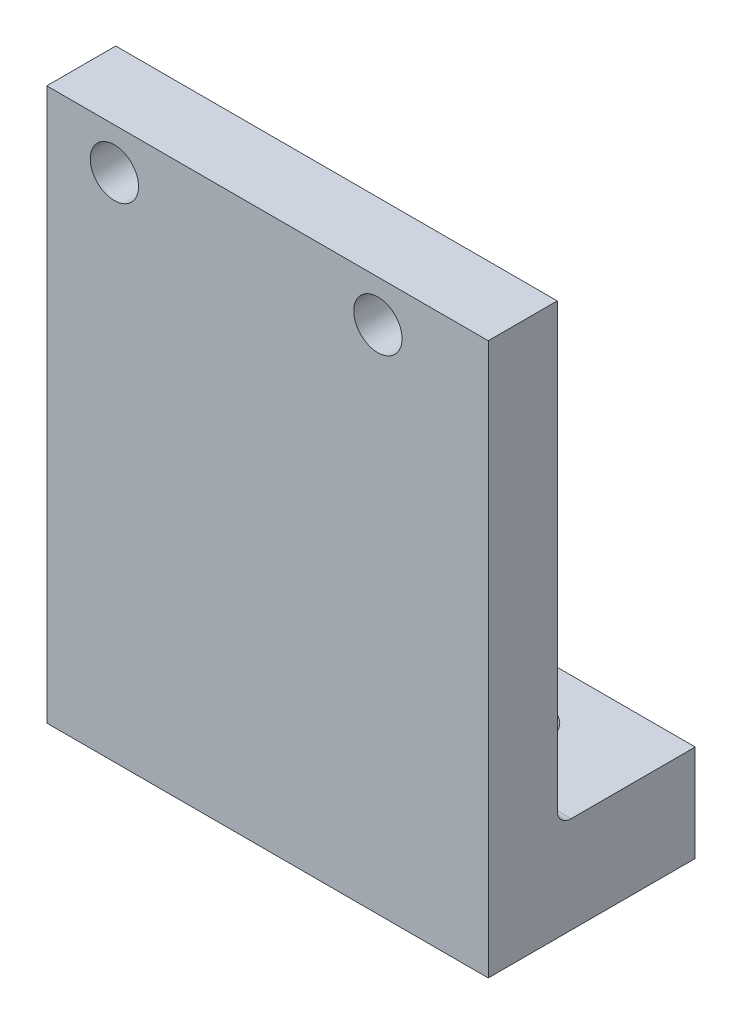
ISO-10303-21;
HEADER;
FILE_DESCRIPTION(('STEP AP214'),'2;1');
FILE_NAME('part.step','',(''),(''),'','','');
FILE_SCHEMA(('AUTOMOTIVE_DESIGN { 1 0 10303 214 1 1 1 1 }'));
ENDSEC;
DATA;
#1=APPLICATION_CONTEXT('core data for automotive mechanical design processes');
#2=APPLICATION_PROTOCOL_DEFINITION('international standard','automotive_design',2000,#1);
#3=PRODUCT_CONTEXT('',#1,'mechanical');
#4=PRODUCT('Part','Part','',(#3));
#5=PRODUCT_RELATED_PRODUCT_CATEGORY('part','',(#4));
#6=PRODUCT_DEFINITION_FORMATION('','',#4);
#7=PRODUCT_DEFINITION_CONTEXT('part definition',#1,'design');
#8=PRODUCT_DEFINITION('design','',#6,#7);
#9=PRODUCT_DEFINITION_SHAPE('','',#8);
#10=(LENGTH_UNIT() NAMED_UNIT(*) SI_UNIT(.MILLI.,.METRE.));
#11=(NAMED_UNIT(*) PLANE_ANGLE_UNIT() SI_UNIT($,.RADIAN.));
#12=(NAMED_UNIT(*) SI_UNIT($,.STERADIAN.) SOLID_ANGLE_UNIT());
#13=UNCERTAINTY_MEASURE_WITH_UNIT(LENGTH_MEASURE(1.E-05),#10,'distance_accuracy_value','');
#14=(GEOMETRIC_REPRESENTATION_CONTEXT(3) GLOBAL_UNCERTAINTY_ASSIGNED_CONTEXT((#13)) GLOBAL_UNIT_ASSIGNED_CONTEXT((#10,
#11,#12)) REPRESENTATION_CONTEXT('',''));
#15=CARTESIAN_POINT('',(0.,0.,0.));
#16=DIRECTION('',(0.,0.,1.));
#17=DIRECTION('',(1.,0.,0.));
#18=AXIS2_PLACEMENT_3D('',#15,#16,#17);
#19=CARTESIAN_POINT('',(0.,0.,0.));
#20=DIRECTION('',(0.,0.,1.));
#21=DIRECTION('',(1.,0.,0.));
#22=AXIS2_PLACEMENT_3D('',#19,#20,#21);
#23=PLANE('',#22);
#24=CARTESIAN_POINT('',(-11.1,7.,0.));
#25=DIRECTION('',(0.,0.,1.));
#26=DIRECTION('',(1.,0.,0.));
#27=AXIS2_PLACEMENT_3D('',#24,#25,#26);
#28=CIRCLE('',#27,1.75);
#29=CARTESIAN_POINT('',(-9.35,7.,0.));
#30=VERTEX_POINT('',#29);
#31=EDGE_CURVE('E116',#30,#30,#28,.T.);
#32=ORIENTED_EDGE('',*,*,#31,.T.);
#33=EDGE_LOOP('',(#32));
#34=FACE_BOUND('',#33,.T.);
#35=CARTESIAN_POINT('',(8.,7.,0.));
#36=DIRECTION('',(0.,0.,1.));
#37=DIRECTION('',(1.,0.,0.));
#38=AXIS2_PLACEMENT_3D('',#35,#36,#37);
#39=CIRCLE('',#38,1.75);
#40=CARTESIAN_POINT('',(9.75,7.,0.));
#41=VERTEX_POINT('',#40);
#42=EDGE_CURVE('E120',#41,#41,#39,.T.);
#43=ORIENTED_EDGE('',*,*,#42,.T.);
#44=EDGE_LOOP('',(#43));
#45=FACE_BOUND('',#44,.T.);
#46=DIRECTION('',(0.,1.,0.));
#47=VECTOR('',#46,1.);
#48=CARTESIAN_POINT('',(16.,10.,0.));
#49=LINE('',#48,#47);
#50=CARTESIAN_POINT('',(16.,-22.,0.));
#51=VERTEX_POINT('',#50);
#52=CARTESIAN_POINT('',(16.,10.,0.));
#53=VERTEX_POINT('',#52);
#54=EDGE_CURVE('E126',#51,#53,#49,.T.);
#55=ORIENTED_EDGE('',*,*,#54,.F.);
#56=DIRECTION('',(1.,0.,0.));
#57=VECTOR('',#56,1.);
#58=CARTESIAN_POINT('',(-16.,-22.,0.));
#59=LINE('',#58,#57);
#60=CARTESIAN_POINT('',(-16.,-22.,0.));
#61=VERTEX_POINT('',#60);
#62=EDGE_CURVE('E38',#51,#61,#59,.F.);
#63=ORIENTED_EDGE('',*,*,#62,.T.);
#64=DIRECTION('',(0.,-1.,0.));
#65=VECTOR('',#64,1.);
#66=CARTESIAN_POINT('',(-16.,10.,0.));
#67=LINE('',#66,#65);
#68=CARTESIAN_POINT('',(-16.,10.,0.));
#69=VERTEX_POINT('',#68);
#70=EDGE_CURVE('E131',#69,#61,#67,.T.);
#71=ORIENTED_EDGE('',*,*,#70,.F.);
#72=DIRECTION('',(-1.,0.,0.));
#73=VECTOR('',#72,1.);
#74=CARTESIAN_POINT('',(16.,10.,0.));
#75=LINE('',#74,#73);
#76=EDGE_CURVE('E137',#53,#69,#75,.T.);
#77=ORIENTED_EDGE('',*,*,#76,.F.);
#78=EDGE_LOOP('',(#55,#63,#71,#77));
#79=FACE_BOUND('',#78,.T.);
#80=ADVANCED_FACE('F17',(#34,#45,#79),#23,.F.);
#81=CARTESIAN_POINT('',(0.,0.,5.));
#82=DIRECTION('',(0.,0.,1.));
#83=DIRECTION('',(1.,0.,0.));
#84=AXIS2_PLACEMENT_3D('',#81,#82,#83);
#85=PLANE('',#84);
#86=CARTESIAN_POINT('',(8.,7.,5.));
#87=DIRECTION('',(0.,0.,1.));
#88=DIRECTION('',(1.,0.,0.));
#89=AXIS2_PLACEMENT_3D('',#86,#87,#88);
#90=CIRCLE('',#89,1.75);
#91=CARTESIAN_POINT('',(9.75,7.,5.));
#92=VERTEX_POINT('',#91);
#93=EDGE_CURVE('E123',#92,#92,#90,.T.);
#94=ORIENTED_EDGE('',*,*,#93,.F.);
#95=EDGE_LOOP('',(#94));
#96=FACE_BOUND('',#95,.T.);
#97=DIRECTION('',(0.,1.,0.));
#98=VECTOR('',#97,1.);
#99=CARTESIAN_POINT('',(16.,10.,5.));
#100=LINE('',#99,#98);
#101=CARTESIAN_POINT('',(16.,-30.,5.));
#102=VERTEX_POINT('',#101);
#103=CARTESIAN_POINT('',(16.,10.,5.));
#104=VERTEX_POINT('',#103);
#105=EDGE_CURVE('E82',#102,#104,#100,.T.);
#106=ORIENTED_EDGE('',*,*,#105,.T.);
#107=DIRECTION('',(-1.,0.,0.));
#108=VECTOR('',#107,1.);
#109=CARTESIAN_POINT('',(16.,10.,5.));
#110=LINE('',#109,#108);
#111=CARTESIAN_POINT('',(-16.,10.,5.));
#112=VERTEX_POINT('',#111);
#113=EDGE_CURVE('E130',#104,#112,#110,.T.);
#114=ORIENTED_EDGE('',*,*,#113,.T.);
#115=DIRECTION('',(0.,-1.,0.));
#116=VECTOR('',#115,1.);
#117=CARTESIAN_POINT('',(-16.,10.,5.));
#118=LINE('',#117,#116);
#119=CARTESIAN_POINT('',(-16.,-30.,5.));
#120=VERTEX_POINT('',#119);
#121=EDGE_CURVE('E133',#112,#120,#118,.T.);
#122=ORIENTED_EDGE('',*,*,#121,.T.);
#123=DIRECTION('',(1.,0.,0.));
#124=VECTOR('',#123,1.);
#125=CARTESIAN_POINT('',(-16.,-30.,5.));
#126=LINE('',#125,#124);
#127=EDGE_CURVE('E86',#120,#102,#126,.T.);
#128=ORIENTED_EDGE('',*,*,#127,.T.);
#129=EDGE_LOOP('',(#106,#114,#122,#128));
#130=FACE_BOUND('',#129,.T.);
#131=CARTESIAN_POINT('',(-11.1,7.,5.));
#132=DIRECTION('',(0.,0.,1.));
#133=DIRECTION('',(1.,0.,0.));
#134=AXIS2_PLACEMENT_3D('',#131,#132,#133);
#135=CIRCLE('',#134,1.75);
#136=CARTESIAN_POINT('',(-9.35,7.,5.));
#137=VERTEX_POINT('',#136);
#138=EDGE_CURVE('E117',#137,#137,#135,.T.);
#139=ORIENTED_EDGE('',*,*,#138,.F.);
#140=EDGE_LOOP('',(#139));
#141=FACE_BOUND('',#140,.T.);
#142=ADVANCED_FACE('F164',(#96,#130,#141),#85,.T.);
#143=CARTESIAN_POINT('',(16.,10.,5.));
#144=DIRECTION('',(-1.,0.,0.));
#145=DIRECTION('',(0.,-1.,0.));
#146=AXIS2_PLACEMENT_3D('',#143,#144,#145);
#147=PLANE('',#146);
#148=DIRECTION('',(0.,0.,-1.));
#149=VECTOR('',#148,1.);
#150=CARTESIAN_POINT('',(16.,-30.,5.));
#151=LINE('',#150,#149);
#152=CARTESIAN_POINT('',(16.,-30.,-10.));
#153=VERTEX_POINT('',#152);
#154=EDGE_CURVE('E75',#102,#153,#151,.T.);
#155=ORIENTED_EDGE('',*,*,#154,.T.);
#156=DIRECTION('',(0.,-1.,0.));
#157=VECTOR('',#156,1.);
#158=CARTESIAN_POINT('',(16.,-30.,-10.));
#159=LINE('',#158,#157);
#160=CARTESIAN_POINT('',(16.,-23.,-10.));
#161=VERTEX_POINT('',#160);
#162=EDGE_CURVE('E79',#161,#153,#159,.T.);
#163=ORIENTED_EDGE('',*,*,#162,.F.);
#164=DIRECTION('',(0.,0.,1.));
#165=VECTOR('',#164,1.);
#166=CARTESIAN_POINT('',(16.,-23.,-10.));
#167=LINE('',#166,#165);
#168=CARTESIAN_POINT('',(16.,-23.,-1.));
#169=VERTEX_POINT('',#168);
#170=EDGE_CURVE('E111',#161,#169,#167,.T.);
#171=ORIENTED_EDGE('',*,*,#170,.T.);
#172=CARTESIAN_POINT('',(16.,-22.,-1.));
#173=DIRECTION('',(-1.,0.,0.));
#174=DIRECTION('',(0.,-1.,0.));
#175=AXIS2_PLACEMENT_3D('',#172,#173,#174);
#176=CIRCLE('',#175,1.);
#177=EDGE_CURVE('E25',#169,#51,#176,.T.);
#178=ORIENTED_EDGE('',*,*,#177,.T.);
#179=ORIENTED_EDGE('',*,*,#54,.T.);
#180=DIRECTION('',(0.,0.,-1.));
#181=VECTOR('',#180,1.);
#182=CARTESIAN_POINT('',(16.,10.,5.));
#183=LINE('',#182,#181);
#184=EDGE_CURVE('E144',#104,#53,#183,.T.);
#185=ORIENTED_EDGE('',*,*,#184,.F.);
#186=ORIENTED_EDGE('',*,*,#105,.F.);
#187=EDGE_LOOP('',(#155,#163,#171,#178,#179,#185,#186));
#188=FACE_BOUND('',#187,.T.);
#189=ADVANCED_FACE('F77',(#188),#147,.F.);
#190=CARTESIAN_POINT('',(16.,10.,5.));
#191=DIRECTION('',(0.,-1.,0.));
#192=DIRECTION('',(1.,0.,0.));
#193=AXIS2_PLACEMENT_3D('',#190,#191,#192);
#194=PLANE('',#193);
#195=ORIENTED_EDGE('',*,*,#76,.T.);
#196=DIRECTION('',(0.,0.,-1.));
#197=VECTOR('',#196,1.);
#198=CARTESIAN_POINT('',(-16.,10.,5.));
#199=LINE('',#198,#197);
#200=EDGE_CURVE('E141',#112,#69,#199,.T.);
#201=ORIENTED_EDGE('',*,*,#200,.F.);
#202=ORIENTED_EDGE('',*,*,#113,.F.);
#203=ORIENTED_EDGE('',*,*,#184,.T.);
#204=EDGE_LOOP('',(#195,#201,#202,#203));
#205=FACE_BOUND('',#204,.T.);
#206=ADVANCED_FACE('F162',(#205),#194,.F.);
#207=CARTESIAN_POINT('',(-16.,10.,5.));
#208=DIRECTION('',(1.,0.,0.));
#209=DIRECTION('',(0.,0.,-1.));
#210=AXIS2_PLACEMENT_3D('',#207,#208,#209);
#211=PLANE('',#210);
#212=ORIENTED_EDGE('',*,*,#70,.T.);
#213=CARTESIAN_POINT('',(-16.,-22.,-1.));
#214=DIRECTION('',(1.,0.,0.));
#215=DIRECTION('',(0.,0.,-1.));
#216=AXIS2_PLACEMENT_3D('',#213,#214,#215);
#217=CIRCLE('',#216,1.);
#218=CARTESIAN_POINT('',(-16.,-23.,-1.));
#219=VERTEX_POINT('',#218);
#220=EDGE_CURVE('E11',#61,#219,#217,.T.);
#221=ORIENTED_EDGE('',*,*,#220,.T.);
#222=DIRECTION('',(0.,0.,1.));
#223=VECTOR('',#222,1.);
#224=CARTESIAN_POINT('',(-16.,-23.,-10.));
#225=LINE('',#224,#223);
#226=CARTESIAN_POINT('',(-16.,-23.,-10.));
#227=VERTEX_POINT('',#226);
#228=EDGE_CURVE('E113',#227,#219,#225,.T.);
#229=ORIENTED_EDGE('',*,*,#228,.F.);
#230=DIRECTION('',(0.,1.,0.));
#231=VECTOR('',#230,1.);
#232=CARTESIAN_POINT('',(-16.,-30.,-10.));
#233=LINE('',#232,#231);
#234=CARTESIAN_POINT('',(-16.,-30.,-10.));
#235=VERTEX_POINT('',#234);
#236=EDGE_CURVE('E94',#235,#227,#233,.T.);
#237=ORIENTED_EDGE('',*,*,#236,.F.);
#238=DIRECTION('',(0.,0.,-1.));
#239=VECTOR('',#238,1.);
#240=CARTESIAN_POINT('',(-16.,-30.,5.));
#241=LINE('',#240,#239);
#242=EDGE_CURVE('E85',#120,#235,#241,.T.);
#243=ORIENTED_EDGE('',*,*,#242,.F.);
#244=ORIENTED_EDGE('',*,*,#121,.F.);
#245=ORIENTED_EDGE('',*,*,#200,.T.);
#246=EDGE_LOOP('',(#212,#221,#229,#237,#243,#244,#245));
#247=FACE_BOUND('',#246,.T.);
#248=ADVANCED_FACE('F157',(#247),#211,.F.);
#249=CARTESIAN_POINT('',(-16.,-30.,5.));
#250=DIRECTION('',(0.,1.,0.));
#251=DIRECTION('',(0.,0.,1.));
#252=AXIS2_PLACEMENT_3D('',#249,#250,#251);
#253=PLANE('',#252);
#254=CARTESIAN_POINT('',(-8.,-30.,-5.));
#255=DIRECTION('',(0.,1.,0.));
#256=DIRECTION('',(-1.,0.,0.));
#257=AXIS2_PLACEMENT_3D('',#254,#255,#256);
#258=CIRCLE('',#257,2.25);
#259=CARTESIAN_POINT('',(-10.25,-30.,-5.));
#260=VERTEX_POINT('',#259);
#261=EDGE_CURVE('E100',#260,#260,#258,.T.);
#262=ORIENTED_EDGE('',*,*,#261,.T.);
#263=EDGE_LOOP('',(#262));
#264=FACE_BOUND('',#263,.T.);
#265=CARTESIAN_POINT('',(8.,-30.,-5.));
#266=DIRECTION('',(0.,1.,0.));
#267=DIRECTION('',(-1.,0.,0.));
#268=AXIS2_PLACEMENT_3D('',#265,#266,#267);
#269=CIRCLE('',#268,2.25);
#270=CARTESIAN_POINT('',(5.75,-30.,-5.));
#271=VERTEX_POINT('',#270);
#272=EDGE_CURVE('E288',#271,#271,#269,.T.);
#273=ORIENTED_EDGE('',*,*,#272,.T.);
#274=EDGE_LOOP('',(#273));
#275=FACE_BOUND('',#274,.T.);
#276=ORIENTED_EDGE('',*,*,#242,.T.);
#277=DIRECTION('',(-1.,0.,0.));
#278=VECTOR('',#277,1.);
#279=CARTESIAN_POINT('',(16.,-30.,-10.));
#280=LINE('',#279,#278);
#281=EDGE_CURVE('E89',#153,#235,#280,.T.);
#282=ORIENTED_EDGE('',*,*,#281,.F.);
#283=ORIENTED_EDGE('',*,*,#154,.F.);
#284=ORIENTED_EDGE('',*,*,#127,.F.);
#285=EDGE_LOOP('',(#276,#282,#283,#284));
#286=FACE_BOUND('',#285,.T.);
#287=ADVANCED_FACE('F90',(#264,#275,#286),#253,.F.);
#288=CARTESIAN_POINT('',(8.,7.,5.));
#289=DIRECTION('',(0.,0.,-1.));
#290=DIRECTION('',(-1.,0.,0.));
#291=AXIS2_PLACEMENT_3D('',#288,#289,#290);
#292=CYLINDRICAL_SURFACE('',#291,1.75);
#293=ORIENTED_EDGE('',*,*,#93,.T.);
#294=EDGE_LOOP('',(#293));
#295=FACE_BOUND('',#294,.T.);
#296=ORIENTED_EDGE('',*,*,#42,.F.);
#297=EDGE_LOOP('',(#296));
#298=FACE_BOUND('',#297,.T.);
#299=ADVANCED_FACE('F174',(#295,#298),#292,.F.);
#300=CARTESIAN_POINT('',(-11.1,7.,5.));
#301=DIRECTION('',(0.,0.,-1.));
#302=DIRECTION('',(-1.,0.,0.));
#303=AXIS2_PLACEMENT_3D('',#300,#301,#302);
#304=CYLINDRICAL_SURFACE('',#303,1.75);
#305=ORIENTED_EDGE('',*,*,#138,.T.);
#306=EDGE_LOOP('',(#305));
#307=FACE_BOUND('',#306,.T.);
#308=ORIENTED_EDGE('',*,*,#31,.F.);
#309=EDGE_LOOP('',(#308));
#310=FACE_BOUND('',#309,.T.);
#311=ADVANCED_FACE('F171',(#307,#310),#304,.F.);
#312=CARTESIAN_POINT('',(16.,-23.,-10.));
#313=DIRECTION('',(0.,-1.,0.));
#314=DIRECTION('',(0.,0.,-1.));
#315=AXIS2_PLACEMENT_3D('',#312,#313,#314);
#316=PLANE('',#315);
#317=CARTESIAN_POINT('',(-8.,-23.,-5.));
#318=DIRECTION('',(0.,1.,0.));
#319=DIRECTION('',(-1.,0.,0.));
#320=AXIS2_PLACEMENT_3D('',#317,#318,#319);
#321=CIRCLE('',#320,2.25);
#322=CARTESIAN_POINT('',(-10.25,-23.,-5.));
#323=VERTEX_POINT('',#322);
#324=EDGE_CURVE('E103',#323,#323,#321,.T.);
#325=ORIENTED_EDGE('',*,*,#324,.F.);
#326=EDGE_LOOP('',(#325));
#327=FACE_BOUND('',#326,.T.);
#328=CARTESIAN_POINT('',(8.,-23.,-5.));
#329=DIRECTION('',(0.,1.,0.));
#330=DIRECTION('',(-1.,0.,0.));
#331=AXIS2_PLACEMENT_3D('',#328,#329,#330);
#332=CIRCLE('',#331,2.25);
#333=CARTESIAN_POINT('',(5.75,-23.,-5.));
#334=VERTEX_POINT('',#333);
#335=EDGE_CURVE('E106',#334,#334,#332,.T.);
#336=ORIENTED_EDGE('',*,*,#335,.F.);
#337=EDGE_LOOP('',(#336));
#338=FACE_BOUND('',#337,.T.);
#339=ORIENTED_EDGE('',*,*,#228,.T.);
#340=DIRECTION('',(1.,0.,0.));
#341=VECTOR('',#340,1.);
#342=CARTESIAN_POINT('',(16.,-23.,-1.));
#343=LINE('',#342,#341);
#344=EDGE_CURVE('E147',#219,#169,#343,.T.);
#345=ORIENTED_EDGE('',*,*,#344,.T.);
#346=ORIENTED_EDGE('',*,*,#170,.F.);
#347=DIRECTION('',(1.,0.,0.));
#348=VECTOR('',#347,1.);
#349=CARTESIAN_POINT('',(16.,-23.,-10.));
#350=LINE('',#349,#348);
#351=EDGE_CURVE('E98',#227,#161,#350,.T.);
#352=ORIENTED_EDGE('',*,*,#351,.F.);
#353=EDGE_LOOP('',(#339,#345,#346,#352));
#354=FACE_BOUND('',#353,.T.);
#355=ADVANCED_FACE('F152',(#327,#338,#354),#316,.F.);
#356=CARTESIAN_POINT('',(0.,0.,-10.));
#357=DIRECTION('',(0.,0.,1.));
#358=DIRECTION('',(1.,0.,0.));
#359=AXIS2_PLACEMENT_3D('',#356,#357,#358);
#360=PLANE('',#359);
#361=ORIENTED_EDGE('',*,*,#162,.T.);
#362=ORIENTED_EDGE('',*,*,#281,.T.);
#363=ORIENTED_EDGE('',*,*,#236,.T.);
#364=ORIENTED_EDGE('',*,*,#351,.T.);
#365=EDGE_LOOP('',(#361,#362,#363,#364));
#366=FACE_BOUND('',#365,.T.);
#367=ADVANCED_FACE('F96',(#366),#360,.F.);
#368=CARTESIAN_POINT('',(8.,-30.,-5.));
#369=DIRECTION('',(0.,1.,0.));
#370=DIRECTION('',(-1.,0.,0.));
#371=AXIS2_PLACEMENT_3D('',#368,#369,#370);
#372=CYLINDRICAL_SURFACE('',#371,2.25);
#373=ORIENTED_EDGE('',*,*,#272,.F.);
#374=EDGE_LOOP('',(#373));
#375=FACE_BOUND('',#374,.T.);
#376=ORIENTED_EDGE('',*,*,#335,.T.);
#377=EDGE_LOOP('',(#376));
#378=FACE_BOUND('',#377,.T.);
#379=ADVANCED_FACE('F253',(#375,#378),#372,.F.);
#380=CARTESIAN_POINT('',(-8.,-30.,-5.));
#381=DIRECTION('',(0.,1.,0.));
#382=DIRECTION('',(-1.,0.,0.));
#383=AXIS2_PLACEMENT_3D('',#380,#381,#382);
#384=CYLINDRICAL_SURFACE('',#383,2.25);
#385=ORIENTED_EDGE('',*,*,#261,.F.);
#386=EDGE_LOOP('',(#385));
#387=FACE_BOUND('',#386,.T.);
#388=ORIENTED_EDGE('',*,*,#324,.T.);
#389=EDGE_LOOP('',(#388));
#390=FACE_BOUND('',#389,.T.);
#391=ADVANCED_FACE('F262',(#387,#390),#384,.F.);
#392=CARTESIAN_POINT('',(16.,-22.,-1.));
#393=DIRECTION('',(-1.,0.,0.));
#394=DIRECTION('',(0.,0.,1.));
#395=AXIS2_PLACEMENT_3D('',#392,#393,#394);
#396=CYLINDRICAL_SURFACE('',#395,1.);
#397=ORIENTED_EDGE('',*,*,#220,.F.);
#398=ORIENTED_EDGE('',*,*,#62,.F.);
#399=ORIENTED_EDGE('',*,*,#177,.F.);
#400=ORIENTED_EDGE('',*,*,#344,.F.);
#401=EDGE_LOOP('',(#397,#398,#399,#400));
#402=FACE_BOUND('',#401,.T.);
#403=ADVANCED_FACE('F19',(#402),#396,.F.);
#404=CLOSED_SHELL('',(#80,#142,#189,#206,#248,#287,#299,#311,#355,#367,#379,#391,#403));
#405=MANIFOLD_SOLID_BREP('B1',#404);
#406=ADVANCED_BREP_SHAPE_REPRESENTATION('',(#18,#405),#14);
#407=SHAPE_DEFINITION_REPRESENTATION(#9,#406);
ENDSEC;
END-ISO-10303-21;
